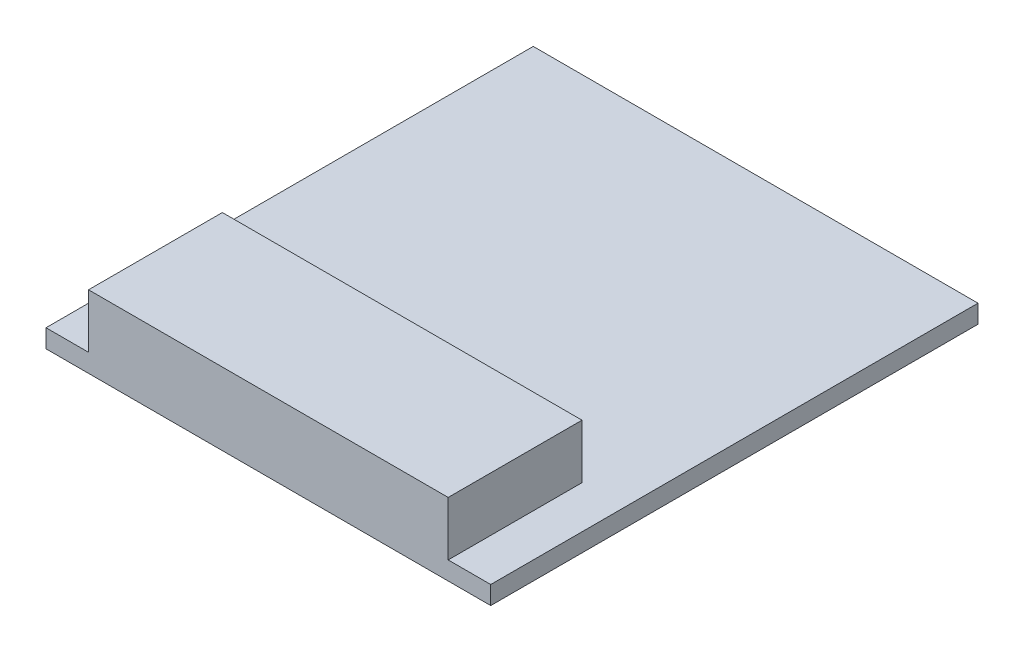
ISO-10303-21;
HEADER;
FILE_DESCRIPTION(('STEP AP214'),'2;1');
FILE_NAME('part.step','',(''),(''),'','','');
FILE_SCHEMA(('AUTOMOTIVE_DESIGN { 1 0 10303 214 1 1 1 1 }'));
ENDSEC;
DATA;
#1=APPLICATION_CONTEXT('core data for automotive mechanical design processes');
#2=APPLICATION_PROTOCOL_DEFINITION('international standard','automotive_design',2000,#1);
#3=PRODUCT_CONTEXT('',#1,'mechanical');
#4=PRODUCT('Part','Part','',(#3));
#5=PRODUCT_RELATED_PRODUCT_CATEGORY('part','',(#4));
#6=PRODUCT_DEFINITION_FORMATION('','',#4);
#7=PRODUCT_DEFINITION_CONTEXT('part definition',#1,'design');
#8=PRODUCT_DEFINITION('design','',#6,#7);
#9=PRODUCT_DEFINITION_SHAPE('','',#8);
#10=(LENGTH_UNIT() NAMED_UNIT(*) SI_UNIT(.MILLI.,.METRE.));
#11=(NAMED_UNIT(*) PLANE_ANGLE_UNIT() SI_UNIT($,.RADIAN.));
#12=(NAMED_UNIT(*) SI_UNIT($,.STERADIAN.) SOLID_ANGLE_UNIT());
#13=UNCERTAINTY_MEASURE_WITH_UNIT(LENGTH_MEASURE(1.E-05),#10,'distance_accuracy_value','');
#14=(GEOMETRIC_REPRESENTATION_CONTEXT(3) GLOBAL_UNCERTAINTY_ASSIGNED_CONTEXT((#13)) GLOBAL_UNIT_ASSIGNED_CONTEXT((#10,
#11,#12)) REPRESENTATION_CONTEXT('',''));
#15=CARTESIAN_POINT('',(0.,0.,0.));
#16=DIRECTION('',(0.,0.,1.));
#17=DIRECTION('',(1.,0.,0.));
#18=AXIS2_PLACEMENT_3D('',#15,#16,#17);
#19=CARTESIAN_POINT('',(0.,0.6,0.));
#20=DIRECTION('',(0.,-1.,0.));
#21=DIRECTION('',(0.,0.,-1.));
#22=AXIS2_PLACEMENT_3D('',#19,#20,#21);
#23=PLANE('',#22);
#24=DIRECTION('',(0.,0.,-1.));
#25=VECTOR('',#24,1.);
#26=CARTESIAN_POINT('',(8.603,0.6,-2.8922));
#27=LINE('',#26,#25);
#28=CARTESIAN_POINT('',(8.603,0.6,1.502));
#29=VERTEX_POINT('',#28);
#30=CARTESIAN_POINT('',(8.603,0.6,-2.8922));
#31=VERTEX_POINT('',#30);
#32=EDGE_CURVE('E55',#29,#31,#27,.T.);
#33=ORIENTED_EDGE('',*,*,#32,.F.);
#34=DIRECTION('',(1.,0.,0.));
#35=VECTOR('',#34,1.);
#36=CARTESIAN_POINT('',(-4.605,0.6,1.502));
#37=LINE('',#36,#35);
#38=CARTESIAN_POINT('',(10.,0.6,1.502));
#39=VERTEX_POINT('',#38);
#40=EDGE_CURVE('E137',#29,#39,#37,.T.);
#41=ORIENTED_EDGE('',*,*,#40,.T.);
#42=DIRECTION('',(0.,0.,-1.));
#43=VECTOR('',#42,1.);
#44=CARTESIAN_POINT('',(10.,0.6,1.502));
#45=LINE('',#44,#43);
#46=CARTESIAN_POINT('',(10.,0.6,-14.5));
#47=VERTEX_POINT('',#46);
#48=EDGE_CURVE('E135',#39,#47,#45,.T.);
#49=ORIENTED_EDGE('',*,*,#48,.T.);
#50=DIRECTION('',(1.,0.,0.));
#51=VECTOR('',#50,1.);
#52=CARTESIAN_POINT('',(-4.605,0.6,-14.5));
#53=LINE('',#52,#51);
#54=CARTESIAN_POINT('',(-4.605,0.6,-14.5));
#55=VERTEX_POINT('',#54);
#56=EDGE_CURVE('E131',#55,#47,#53,.T.);
#57=ORIENTED_EDGE('',*,*,#56,.F.);
#58=DIRECTION('',(0.,0.,-1.));
#59=VECTOR('',#58,1.);
#60=CARTESIAN_POINT('',(-4.605,0.6,1.502));
#61=LINE('',#60,#59);
#62=CARTESIAN_POINT('',(-4.605,0.6,1.502));
#63=VERTEX_POINT('',#62);
#64=EDGE_CURVE('E128',#63,#55,#61,.T.);
#65=ORIENTED_EDGE('',*,*,#64,.F.);
#66=CARTESIAN_POINT('',(-3.208,0.6,1.502));
#67=VERTEX_POINT('',#66);
#68=EDGE_CURVE('E144',#63,#67,#37,.T.);
#69=ORIENTED_EDGE('',*,*,#68,.T.);
#70=DIRECTION('',(0.,0.,1.));
#71=VECTOR('',#70,1.);
#72=CARTESIAN_POINT('',(-3.208,0.6,-2.8922));
#73=LINE('',#72,#71);
#74=CARTESIAN_POINT('',(-3.208,0.6,-2.8922));
#75=VERTEX_POINT('',#74);
#76=EDGE_CURVE('E116',#75,#67,#73,.T.);
#77=ORIENTED_EDGE('',*,*,#76,.F.);
#78=DIRECTION('',(-1.,0.,0.));
#79=VECTOR('',#78,1.);
#80=CARTESIAN_POINT('',(-3.208,0.6,-2.8922));
#81=LINE('',#80,#79);
#82=EDGE_CURVE('E50',#31,#75,#81,.T.);
#83=ORIENTED_EDGE('',*,*,#82,.F.);
#84=EDGE_LOOP('',(#33,#41,#49,#57,#65,#69,#77,#83));
#85=FACE_BOUND('',#84,.T.);
#86=ADVANCED_FACE('F33',(#85),#23,.F.);
#87=CARTESIAN_POINT('',(-4.605,0.6,1.502));
#88=DIRECTION('',(-1.,0.,0.));
#89=DIRECTION('',(0.,0.,1.));
#90=AXIS2_PLACEMENT_3D('',#87,#88,#89);
#91=PLANE('',#90);
#92=DIRECTION('',(0.,0.,-1.));
#93=VECTOR('',#92,1.);
#94=CARTESIAN_POINT('',(-4.605,0.,1.502));
#95=LINE('',#94,#93);
#96=CARTESIAN_POINT('',(-4.605,0.,1.502));
#97=VERTEX_POINT('',#96);
#98=CARTESIAN_POINT('',(-4.605,0.,-14.5));
#99=VERTEX_POINT('',#98);
#100=EDGE_CURVE('E119',#97,#99,#95,.T.);
#101=ORIENTED_EDGE('',*,*,#100,.F.);
#102=DIRECTION('',(0.,-1.,0.));
#103=VECTOR('',#102,1.);
#104=CARTESIAN_POINT('',(-4.605,0.6,1.502));
#105=LINE('',#104,#103);
#106=EDGE_CURVE('E11',#63,#97,#105,.T.);
#107=ORIENTED_EDGE('',*,*,#106,.F.);
#108=ORIENTED_EDGE('',*,*,#64,.T.);
#109=DIRECTION('',(0.,-1.,0.));
#110=VECTOR('',#109,1.);
#111=CARTESIAN_POINT('',(-4.605,0.6,-14.5));
#112=LINE('',#111,#110);
#113=EDGE_CURVE('E146',#55,#99,#112,.T.);
#114=ORIENTED_EDGE('',*,*,#113,.T.);
#115=EDGE_LOOP('',(#101,#107,#108,#114));
#116=FACE_BOUND('',#115,.T.);
#117=ADVANCED_FACE('F35',(#116),#91,.T.);
#118=CARTESIAN_POINT('',(-4.605,0.6,1.502));
#119=DIRECTION('',(0.,0.,-1.));
#120=DIRECTION('',(-1.,0.,0.));
#121=AXIS2_PLACEMENT_3D('',#118,#119,#120);
#122=PLANE('',#121);
#123=DIRECTION('',(1.,0.,0.));
#124=VECTOR('',#123,1.);
#125=CARTESIAN_POINT('',(-4.605,0.,1.502));
#126=LINE('',#125,#124);
#127=CARTESIAN_POINT('',(10.,0.,1.502));
#128=VERTEX_POINT('',#127);
#129=EDGE_CURVE('E132',#97,#128,#126,.T.);
#130=ORIENTED_EDGE('',*,*,#129,.T.);
#131=DIRECTION('',(0.,-1.,0.));
#132=VECTOR('',#131,1.);
#133=CARTESIAN_POINT('',(10.,0.6,1.502));
#134=LINE('',#133,#132);
#135=EDGE_CURVE('E42',#39,#128,#134,.T.);
#136=ORIENTED_EDGE('',*,*,#135,.F.);
#137=ORIENTED_EDGE('',*,*,#40,.F.);
#138=DIRECTION('',(0.,-1.,0.));
#139=VECTOR('',#138,1.);
#140=CARTESIAN_POINT('',(8.603,2.378,1.502));
#141=LINE('',#140,#139);
#142=CARTESIAN_POINT('',(8.603,2.378,1.502));
#143=VERTEX_POINT('',#142);
#144=EDGE_CURVE('E181',#143,#29,#141,.T.);
#145=ORIENTED_EDGE('',*,*,#144,.F.);
#146=DIRECTION('',(1.,0.,0.));
#147=VECTOR('',#146,1.);
#148=CARTESIAN_POINT('',(-3.208,2.378,1.502));
#149=LINE('',#148,#147);
#150=CARTESIAN_POINT('',(-3.208,2.378,1.502));
#151=VERTEX_POINT('',#150);
#152=EDGE_CURVE('E112',#151,#143,#149,.T.);
#153=ORIENTED_EDGE('',*,*,#152,.F.);
#154=DIRECTION('',(0.,-1.,0.));
#155=VECTOR('',#154,1.);
#156=CARTESIAN_POINT('',(-3.208,2.378,1.502));
#157=LINE('',#156,#155);
#158=EDGE_CURVE('E124',#151,#67,#157,.T.);
#159=ORIENTED_EDGE('',*,*,#158,.T.);
#160=ORIENTED_EDGE('',*,*,#68,.F.);
#161=ORIENTED_EDGE('',*,*,#106,.T.);
#162=EDGE_LOOP('',(#130,#136,#137,#145,#153,#159,#160,#161));
#163=FACE_BOUND('',#162,.T.);
#164=ADVANCED_FACE('F171',(#163),#122,.F.);
#165=CARTESIAN_POINT('',(10.,0.6,1.502));
#166=DIRECTION('',(-1.,0.,0.));
#167=DIRECTION('',(0.,0.,1.));
#168=AXIS2_PLACEMENT_3D('',#165,#166,#167);
#169=PLANE('',#168);
#170=DIRECTION('',(0.,0.,-1.));
#171=VECTOR('',#170,1.);
#172=CARTESIAN_POINT('',(10.,0.,1.502));
#173=LINE('',#172,#171);
#174=CARTESIAN_POINT('',(10.,0.,-14.5));
#175=VERTEX_POINT('',#174);
#176=EDGE_CURVE('E153',#128,#175,#173,.T.);
#177=ORIENTED_EDGE('',*,*,#176,.T.);
#178=DIRECTION('',(0.,-1.,0.));
#179=VECTOR('',#178,1.);
#180=CARTESIAN_POINT('',(10.,0.6,-14.5));
#181=LINE('',#180,#179);
#182=EDGE_CURVE('E148',#47,#175,#181,.T.);
#183=ORIENTED_EDGE('',*,*,#182,.F.);
#184=ORIENTED_EDGE('',*,*,#48,.F.);
#185=ORIENTED_EDGE('',*,*,#135,.T.);
#186=EDGE_LOOP('',(#177,#183,#184,#185));
#187=FACE_BOUND('',#186,.T.);
#188=ADVANCED_FACE('F168',(#187),#169,.F.);
#189=CARTESIAN_POINT('',(-4.605,0.6,-14.5));
#190=DIRECTION('',(0.,0.,-1.));
#191=DIRECTION('',(-1.,0.,0.));
#192=AXIS2_PLACEMENT_3D('',#189,#190,#191);
#193=PLANE('',#192);
#194=DIRECTION('',(1.,0.,0.));
#195=VECTOR('',#194,1.);
#196=CARTESIAN_POINT('',(-4.605,0.,-14.5));
#197=LINE('',#196,#195);
#198=EDGE_CURVE('E122',#99,#175,#197,.T.);
#199=ORIENTED_EDGE('',*,*,#198,.F.);
#200=ORIENTED_EDGE('',*,*,#113,.F.);
#201=ORIENTED_EDGE('',*,*,#56,.T.);
#202=ORIENTED_EDGE('',*,*,#182,.T.);
#203=EDGE_LOOP('',(#199,#200,#201,#202));
#204=FACE_BOUND('',#203,.T.);
#205=ADVANCED_FACE('F163',(#204),#193,.T.);
#206=CARTESIAN_POINT('',(0.,0.,0.));
#207=DIRECTION('',(0.,-1.,0.));
#208=DIRECTION('',(0.,0.,-1.));
#209=AXIS2_PLACEMENT_3D('',#206,#207,#208);
#210=PLANE('',#209);
#211=ORIENTED_EDGE('',*,*,#100,.T.);
#212=ORIENTED_EDGE('',*,*,#198,.T.);
#213=ORIENTED_EDGE('',*,*,#176,.F.);
#214=ORIENTED_EDGE('',*,*,#129,.F.);
#215=EDGE_LOOP('',(#211,#212,#213,#214));
#216=FACE_BOUND('',#215,.T.);
#217=ADVANCED_FACE('F159',(#216),#210,.T.);
#218=CARTESIAN_POINT('',(8.603,2.378,-2.8922));
#219=DIRECTION('',(-1.,0.,0.));
#220=DIRECTION('',(0.,0.,1.));
#221=AXIS2_PLACEMENT_3D('',#218,#219,#220);
#222=PLANE('',#221);
#223=ORIENTED_EDGE('',*,*,#32,.T.);
#224=DIRECTION('',(0.,-1.,0.));
#225=VECTOR('',#224,1.);
#226=CARTESIAN_POINT('',(8.603,2.378,-2.8922));
#227=LINE('',#226,#225);
#228=CARTESIAN_POINT('',(8.603,2.378,-2.8922));
#229=VERTEX_POINT('',#228);
#230=EDGE_CURVE('E101',#229,#31,#227,.T.);
#231=ORIENTED_EDGE('',*,*,#230,.F.);
#232=DIRECTION('',(0.,0.,-1.));
#233=VECTOR('',#232,1.);
#234=CARTESIAN_POINT('',(8.603,2.378,-2.8922));
#235=LINE('',#234,#233);
#236=EDGE_CURVE('E107',#143,#229,#235,.T.);
#237=ORIENTED_EDGE('',*,*,#236,.F.);
#238=ORIENTED_EDGE('',*,*,#144,.T.);
#239=EDGE_LOOP('',(#223,#231,#237,#238));
#240=FACE_BOUND('',#239,.T.);
#241=ADVANCED_FACE('F118',(#240),#222,.F.);
#242=CARTESIAN_POINT('',(-3.208,2.378,-2.8922));
#243=DIRECTION('',(0.,0.,1.));
#244=DIRECTION('',(1.,0.,0.));
#245=AXIS2_PLACEMENT_3D('',#242,#243,#244);
#246=PLANE('',#245);
#247=ORIENTED_EDGE('',*,*,#82,.T.);
#248=DIRECTION('',(0.,-1.,0.));
#249=VECTOR('',#248,1.);
#250=CARTESIAN_POINT('',(-3.208,2.378,-2.8922));
#251=LINE('',#250,#249);
#252=CARTESIAN_POINT('',(-3.208,2.378,-2.8922));
#253=VERTEX_POINT('',#252);
#254=EDGE_CURVE('E103',#253,#75,#251,.T.);
#255=ORIENTED_EDGE('',*,*,#254,.F.);
#256=DIRECTION('',(-1.,0.,0.));
#257=VECTOR('',#256,1.);
#258=CARTESIAN_POINT('',(-3.208,2.378,-2.8922));
#259=LINE('',#258,#257);
#260=EDGE_CURVE('E97',#229,#253,#259,.T.);
#261=ORIENTED_EDGE('',*,*,#260,.F.);
#262=ORIENTED_EDGE('',*,*,#230,.T.);
#263=EDGE_LOOP('',(#247,#255,#261,#262));
#264=FACE_BOUND('',#263,.T.);
#265=ADVANCED_FACE('F99',(#264),#246,.F.);
#266=CARTESIAN_POINT('',(-3.208,2.378,-2.8922));
#267=DIRECTION('',(1.,0.,0.));
#268=DIRECTION('',(0.,0.,-1.));
#269=AXIS2_PLACEMENT_3D('',#266,#267,#268);
#270=PLANE('',#269);
#271=ORIENTED_EDGE('',*,*,#76,.T.);
#272=ORIENTED_EDGE('',*,*,#158,.F.);
#273=DIRECTION('',(0.,0.,1.));
#274=VECTOR('',#273,1.);
#275=CARTESIAN_POINT('',(-3.208,2.378,-2.8922));
#276=LINE('',#275,#274);
#277=EDGE_CURVE('E106',#253,#151,#276,.T.);
#278=ORIENTED_EDGE('',*,*,#277,.F.);
#279=ORIENTED_EDGE('',*,*,#254,.T.);
#280=EDGE_LOOP('',(#271,#272,#278,#279));
#281=FACE_BOUND('',#280,.T.);
#282=ADVANCED_FACE('F179',(#281),#270,.F.);
#283=CARTESIAN_POINT('',(0.,2.378,0.));
#284=DIRECTION('',(0.,1.,0.));
#285=DIRECTION('',(0.,0.,1.));
#286=AXIS2_PLACEMENT_3D('',#283,#284,#285);
#287=PLANE('',#286);
#288=ORIENTED_EDGE('',*,*,#236,.T.);
#289=ORIENTED_EDGE('',*,*,#260,.T.);
#290=ORIENTED_EDGE('',*,*,#277,.T.);
#291=ORIENTED_EDGE('',*,*,#152,.T.);
#292=EDGE_LOOP('',(#288,#289,#290,#291));
#293=FACE_BOUND('',#292,.T.);
#294=ADVANCED_FACE('F110',(#293),#287,.T.);
#295=CLOSED_SHELL('',(#86,#117,#164,#188,#205,#217,#241,#265,#282,#294));
#296=MANIFOLD_SOLID_BREP('B2',#295);
#297=ADVANCED_BREP_SHAPE_REPRESENTATION('',(#18,#296),#14);
#298=SHAPE_DEFINITION_REPRESENTATION(#9,#297);
ENDSEC;
END-ISO-10303-21;
